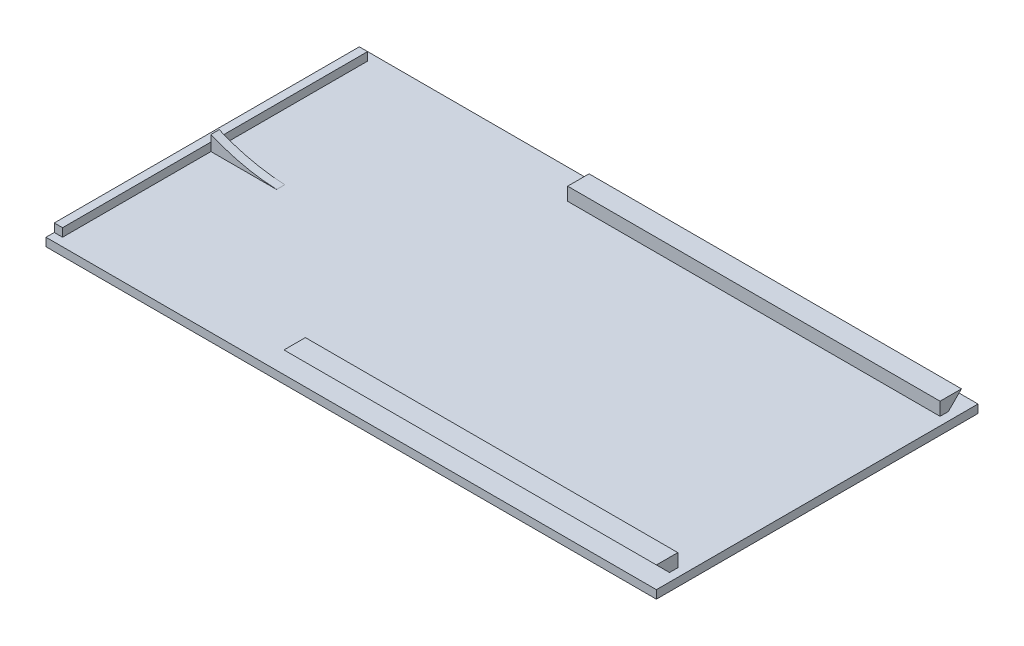
ISO-10303-21;
HEADER;
FILE_DESCRIPTION(('STEP AP214'),'2;1');
FILE_NAME('part.step','',(''),(''),'','','');
FILE_SCHEMA(('AUTOMOTIVE_DESIGN { 1 0 10303 214 1 1 1 1 }'));
ENDSEC;
DATA;
#1=APPLICATION_CONTEXT('core data for automotive mechanical design processes');
#2=APPLICATION_PROTOCOL_DEFINITION('international standard','automotive_design',2000,#1);
#3=PRODUCT_CONTEXT('',#1,'mechanical');
#4=PRODUCT('Part','Part','',(#3));
#5=PRODUCT_RELATED_PRODUCT_CATEGORY('part','',(#4));
#6=PRODUCT_DEFINITION_FORMATION('','',#4);
#7=PRODUCT_DEFINITION_CONTEXT('part definition',#1,'design');
#8=PRODUCT_DEFINITION('design','',#6,#7);
#9=PRODUCT_DEFINITION_SHAPE('','',#8);
#10=(LENGTH_UNIT() NAMED_UNIT(*) SI_UNIT(.MILLI.,.METRE.));
#11=(NAMED_UNIT(*) PLANE_ANGLE_UNIT() SI_UNIT($,.RADIAN.));
#12=(NAMED_UNIT(*) SI_UNIT($,.STERADIAN.) SOLID_ANGLE_UNIT());
#13=UNCERTAINTY_MEASURE_WITH_UNIT(LENGTH_MEASURE(1.E-05),#10,'distance_accuracy_value','');
#14=(GEOMETRIC_REPRESENTATION_CONTEXT(3) GLOBAL_UNCERTAINTY_ASSIGNED_CONTEXT((#13)) GLOBAL_UNIT_ASSIGNED_CONTEXT((#10,
#11,#12)) REPRESENTATION_CONTEXT('',''));
#15=CARTESIAN_POINT('',(0.,0.,0.));
#16=DIRECTION('',(0.,0.,1.));
#17=DIRECTION('',(1.,0.,0.));
#18=AXIS2_PLACEMENT_3D('',#15,#16,#17);
#19=CARTESIAN_POINT('',(0.,1.26,0.));
#20=DIRECTION('',(0.,-1.,0.));
#21=DIRECTION('',(0.,0.,-1.));
#22=AXIS2_PLACEMENT_3D('',#19,#20,#21);
#23=PLANE('',#22);
#24=DIRECTION('',(0.,0.,1.));
#25=VECTOR('',#24,1.);
#26=CARTESIAN_POINT('',(35.,1.26,-44.48));
#27=LINE('',#26,#25);
#28=CARTESIAN_POINT('',(35.,1.26,-45.7377762362813));
#29=VERTEX_POINT('',#28);
#30=CARTESIAN_POINT('',(35.,1.26,-44.48));
#31=VERTEX_POINT('',#30);
#32=EDGE_CURVE('E58',#29,#31,#27,.T.);
#33=ORIENTED_EDGE('',*,*,#32,.F.);
#34=DIRECTION('',(1.,0.,0.));
#35=VECTOR('',#34,1.);
#36=CARTESIAN_POINT('',(29.74,1.26,-45.7377762362813));
#37=LINE('',#36,#35);
#38=CARTESIAN_POINT('',(91.74,1.26,-45.7377762362813));
#39=VERTEX_POINT('',#38);
#40=EDGE_CURVE('E194',#29,#39,#37,.T.);
#41=ORIENTED_EDGE('',*,*,#40,.T.);
#42=DIRECTION('',(0.,0.,-1.));
#43=VECTOR('',#42,1.);
#44=CARTESIAN_POINT('',(91.74,1.26,-44.48));
#45=LINE('',#44,#43);
#46=CARTESIAN_POINT('',(91.74,1.26,-44.48));
#47=VERTEX_POINT('',#46);
#48=EDGE_CURVE('E193',#47,#39,#45,.T.);
#49=ORIENTED_EDGE('',*,*,#48,.F.);
#50=DIRECTION('',(1.,0.,0.));
#51=VECTOR('',#50,1.);
#52=CARTESIAN_POINT('',(35.,1.26,-44.48));
#53=LINE('',#52,#51);
#54=EDGE_CURVE('E205',#31,#47,#53,.T.);
#55=ORIENTED_EDGE('',*,*,#54,.F.);
#56=EDGE_LOOP('',(#33,#41,#49,#55));
#57=FACE_BOUND('',#56,.T.);
#58=DIRECTION('',(1.,0.,0.));
#59=VECTOR('',#58,1.);
#60=CARTESIAN_POINT('',(29.74,1.26,-3.26222376371873));
#61=LINE('',#60,#59);
#62=CARTESIAN_POINT('',(35.,1.26,-3.26222376371873));
#63=VERTEX_POINT('',#62);
#64=CARTESIAN_POINT('',(91.74,1.26,-3.26222376371873));
#65=VERTEX_POINT('',#64);
#66=EDGE_CURVE('E579',#63,#65,#61,.T.);
#67=ORIENTED_EDGE('',*,*,#66,.F.);
#68=DIRECTION('',(0.,0.,1.));
#69=VECTOR('',#68,1.);
#70=CARTESIAN_POINT('',(35.,1.26,-1.26));
#71=LINE('',#70,#69);
#72=CARTESIAN_POINT('',(35.,1.26,-4.52));
#73=VERTEX_POINT('',#72);
#74=EDGE_CURVE('E592',#73,#63,#71,.T.);
#75=ORIENTED_EDGE('',*,*,#74,.F.);
#76=DIRECTION('',(-1.,0.,0.));
#77=VECTOR('',#76,1.);
#78=CARTESIAN_POINT('',(35.,1.26,-4.52));
#79=LINE('',#78,#77);
#80=CARTESIAN_POINT('',(91.74,1.26,-4.52));
#81=VERTEX_POINT('',#80);
#82=EDGE_CURVE('E590',#81,#73,#79,.T.);
#83=ORIENTED_EDGE('',*,*,#82,.F.);
#84=DIRECTION('',(0.,0.,-1.));
#85=VECTOR('',#84,1.);
#86=CARTESIAN_POINT('',(91.74,1.26,-1.26));
#87=LINE('',#86,#85);
#88=EDGE_CURVE('E50',#65,#81,#87,.T.);
#89=ORIENTED_EDGE('',*,*,#88,.F.);
#90=EDGE_LOOP('',(#67,#75,#83,#89));
#91=FACE_BOUND('',#90,.T.);
#92=DIRECTION('',(1.,0.,0.));
#93=VECTOR('',#92,1.);
#94=CARTESIAN_POINT('',(1.25999999999999,1.26,-23.87));
#95=LINE('',#94,#93);
#96=CARTESIAN_POINT('',(1.25999999999999,1.26,-23.87));
#97=VERTEX_POINT('',#96);
#98=CARTESIAN_POINT('',(11.26,1.26,-23.87));
#99=VERTEX_POINT('',#98);
#100=EDGE_CURVE('E218',#97,#99,#95,.T.);
#101=ORIENTED_EDGE('',*,*,#100,.F.);
#102=DIRECTION('',(0.,0.,-1.));
#103=VECTOR('',#102,1.);
#104=CARTESIAN_POINT('',(1.25999999999997,1.26,-47.74));
#105=LINE('',#104,#103);
#106=CARTESIAN_POINT('',(1.25999999999998,1.26,-1.26));
#107=VERTEX_POINT('',#106);
#108=EDGE_CURVE('E250',#107,#97,#105,.T.);
#109=ORIENTED_EDGE('',*,*,#108,.F.);
#110=DIRECTION('',(1.,0.,0.));
#111=VECTOR('',#110,1.);
#112=CARTESIAN_POINT('',(0.,1.26,-1.26));
#113=LINE('',#112,#111);
#114=CARTESIAN_POINT('',(0.,1.26,-1.26));
#115=VERTEX_POINT('',#114);
#116=EDGE_CURVE('E235',#115,#107,#113,.T.);
#117=ORIENTED_EDGE('',*,*,#116,.F.);
#118=DIRECTION('',(0.,0.,1.));
#119=VECTOR('',#118,1.);
#120=CARTESIAN_POINT('',(0.,1.26,0.));
#121=LINE('',#120,#119);
#122=CARTESIAN_POINT('',(0.,1.26,0.));
#123=VERTEX_POINT('',#122);
#124=EDGE_CURVE('E287',#115,#123,#121,.T.);
#125=ORIENTED_EDGE('',*,*,#124,.T.);
#126=DIRECTION('',(1.,0.,0.));
#127=VECTOR('',#126,1.);
#128=CARTESIAN_POINT('',(0.,1.26,0.));
#129=LINE('',#128,#127);
#130=CARTESIAN_POINT('',(93.,1.26,0.));
#131=VERTEX_POINT('',#130);
#132=EDGE_CURVE('E283',#123,#131,#129,.T.);
#133=ORIENTED_EDGE('',*,*,#132,.T.);
#134=DIRECTION('',(0.,0.,-1.));
#135=VECTOR('',#134,1.);
#136=CARTESIAN_POINT('',(93.,1.26,0.));
#137=LINE('',#136,#135);
#138=CARTESIAN_POINT('',(93.,1.26,-49.));
#139=VERTEX_POINT('',#138);
#140=EDGE_CURVE('E309',#131,#139,#137,.T.);
#141=ORIENTED_EDGE('',*,*,#140,.T.);
#142=DIRECTION('',(-1.,0.,0.));
#143=VECTOR('',#142,1.);
#144=CARTESIAN_POINT('',(0.,1.26,-49.));
#145=LINE('',#144,#143);
#146=CARTESIAN_POINT('',(0.,1.26,-49.));
#147=VERTEX_POINT('',#146);
#148=EDGE_CURVE('E300',#139,#147,#145,.T.);
#149=ORIENTED_EDGE('',*,*,#148,.T.);
#150=CARTESIAN_POINT('',(0.,1.26,-47.74));
#151=VERTEX_POINT('',#150);
#152=EDGE_CURVE('E290',#147,#151,#121,.T.);
#153=ORIENTED_EDGE('',*,*,#152,.T.);
#154=DIRECTION('',(-1.,0.,0.));
#155=VECTOR('',#154,1.);
#156=CARTESIAN_POINT('',(0.,1.26,-47.74));
#157=LINE('',#156,#155);
#158=CARTESIAN_POINT('',(1.25999999999997,1.26,-47.74));
#159=VERTEX_POINT('',#158);
#160=EDGE_CURVE('E240',#159,#151,#157,.T.);
#161=ORIENTED_EDGE('',*,*,#160,.F.);
#162=CARTESIAN_POINT('',(1.25999999999998,1.26,-25.13));
#163=VERTEX_POINT('',#162);
#164=EDGE_CURVE('E253',#163,#159,#105,.T.);
#165=ORIENTED_EDGE('',*,*,#164,.F.);
#166=DIRECTION('',(-1.,0.,0.));
#167=VECTOR('',#166,1.);
#168=CARTESIAN_POINT('',(1.25999999999998,1.26,-25.13));
#169=LINE('',#168,#167);
#170=CARTESIAN_POINT('',(11.26,1.26,-25.13));
#171=VERTEX_POINT('',#170);
#172=EDGE_CURVE('E223',#171,#163,#169,.T.);
#173=ORIENTED_EDGE('',*,*,#172,.F.);
#174=DIRECTION('',(0.,0.,-1.));
#175=VECTOR('',#174,1.);
#176=CARTESIAN_POINT('',(11.26,1.26,-25.13));
#177=LINE('',#176,#175);
#178=EDGE_CURVE('E226',#99,#171,#177,.T.);
#179=ORIENTED_EDGE('',*,*,#178,.F.);
#180=EDGE_LOOP('',(#101,#109,#117,#125,#133,#141,#149,#153,#161,#165,#173,#179));
#181=FACE_BOUND('',#180,.T.);
#182=ADVANCED_FACE('F33',(#57,#91,#181),#23,.F.);
#183=CARTESIAN_POINT('',(1.25999999999997,2.52,-47.74));
#184=DIRECTION('',(-1.,0.,0.));
#185=DIRECTION('',(0.,0.,1.));
#186=AXIS2_PLACEMENT_3D('',#183,#184,#185);
#187=PLANE('',#186);
#188=DIRECTION('',(0.,-1.,0.));
#189=VECTOR('',#188,1.);
#190=CARTESIAN_POINT('',(1.25999999999999,3.52,-23.87));
#191=LINE('',#190,#189);
#192=CARTESIAN_POINT('',(1.25999999999999,2.52,-23.87));
#193=VERTEX_POINT('',#192);
#194=EDGE_CURVE('E231',#193,#97,#191,.T.);
#195=ORIENTED_EDGE('',*,*,#194,.F.);
#196=DIRECTION('',(0.,0.,-1.));
#197=VECTOR('',#196,1.);
#198=CARTESIAN_POINT('',(1.25999999999997,2.52,-47.74));
#199=LINE('',#198,#197);
#200=CARTESIAN_POINT('',(1.25999999999998,2.52,-1.26));
#201=VERTEX_POINT('',#200);
#202=EDGE_CURVE('E243',#201,#193,#199,.T.);
#203=ORIENTED_EDGE('',*,*,#202,.F.);
#204=DIRECTION('',(0.,-1.,0.));
#205=VECTOR('',#204,1.);
#206=CARTESIAN_POINT('',(1.25999999999998,2.52,-1.26));
#207=LINE('',#206,#205);
#208=EDGE_CURVE('E269',#201,#107,#207,.T.);
#209=ORIENTED_EDGE('',*,*,#208,.T.);
#210=ORIENTED_EDGE('',*,*,#108,.T.);
#211=EDGE_LOOP('',(#195,#203,#209,#210));
#212=FACE_BOUND('',#211,.T.);
#213=ADVANCED_FACE('F359',(#212),#187,.F.);
#214=DIRECTION('',(0.,-1.,0.));
#215=VECTOR('',#214,1.);
#216=CARTESIAN_POINT('',(1.25999999999998,3.52,-25.13));
#217=LINE('',#216,#215);
#218=CARTESIAN_POINT('',(1.25999999999997,2.52,-25.13));
#219=VERTEX_POINT('',#218);
#220=EDGE_CURVE('E222',#219,#163,#217,.T.);
#221=ORIENTED_EDGE('',*,*,#220,.T.);
#222=ORIENTED_EDGE('',*,*,#164,.T.);
#223=DIRECTION('',(0.,-1.,0.));
#224=VECTOR('',#223,1.);
#225=CARTESIAN_POINT('',(1.25999999999997,2.52,-47.74));
#226=LINE('',#225,#224);
#227=CARTESIAN_POINT('',(1.25999999999997,2.52,-47.74));
#228=VERTEX_POINT('',#227);
#229=EDGE_CURVE('E256',#228,#159,#226,.T.);
#230=ORIENTED_EDGE('',*,*,#229,.F.);
#231=EDGE_CURVE('E242',#219,#228,#199,.T.);
#232=ORIENTED_EDGE('',*,*,#231,.F.);
#233=EDGE_LOOP('',(#221,#222,#230,#232));
#234=FACE_BOUND('',#233,.T.);
#235=ADVANCED_FACE('F338',(#234),#187,.F.);
#236=CARTESIAN_POINT('',(0.,1.26,0.));
#237=DIRECTION('',(1.,0.,0.));
#238=DIRECTION('',(0.,0.,-1.));
#239=AXIS2_PLACEMENT_3D('',#236,#237,#238);
#240=PLANE('',#239);
#241=DIRECTION('',(0.,0.,1.));
#242=VECTOR('',#241,1.);
#243=CARTESIAN_POINT('',(0.,0.,0.));
#244=LINE('',#243,#242);
#245=CARTESIAN_POINT('',(0.,0.,-49.));
#246=VERTEX_POINT('',#245);
#247=CARTESIAN_POINT('',(0.,0.,0.));
#248=VERTEX_POINT('',#247);
#249=EDGE_CURVE('E279',#246,#248,#244,.T.);
#250=ORIENTED_EDGE('',*,*,#249,.T.);
#251=DIRECTION('',(0.,-1.,0.));
#252=VECTOR('',#251,1.);
#253=CARTESIAN_POINT('',(0.,1.26,0.));
#254=LINE('',#253,#252);
#255=EDGE_CURVE('E11',#123,#248,#254,.T.);
#256=ORIENTED_EDGE('',*,*,#255,.F.);
#257=ORIENTED_EDGE('',*,*,#124,.F.);
#258=DIRECTION('',(0.,-1.,0.));
#259=VECTOR('',#258,1.);
#260=CARTESIAN_POINT('',(0.,2.52,-1.26));
#261=LINE('',#260,#259);
#262=CARTESIAN_POINT('',(0.,2.52,-1.26));
#263=VERTEX_POINT('',#262);
#264=EDGE_CURVE('E274',#263,#115,#261,.T.);
#265=ORIENTED_EDGE('',*,*,#264,.F.);
#266=DIRECTION('',(0.,0.,1.));
#267=VECTOR('',#266,1.);
#268=CARTESIAN_POINT('',(0.,2.52,-47.74));
#269=LINE('',#268,#267);
#270=CARTESIAN_POINT('',(0.,2.52,-47.74));
#271=VERTEX_POINT('',#270);
#272=EDGE_CURVE('E236',#271,#263,#269,.T.);
#273=ORIENTED_EDGE('',*,*,#272,.F.);
#274=DIRECTION('',(0.,-1.,0.));
#275=VECTOR('',#274,1.);
#276=CARTESIAN_POINT('',(0.,2.52,-47.74));
#277=LINE('',#276,#275);
#278=EDGE_CURVE('E249',#271,#151,#277,.T.);
#279=ORIENTED_EDGE('',*,*,#278,.T.);
#280=ORIENTED_EDGE('',*,*,#152,.F.);
#281=DIRECTION('',(0.,-1.,0.));
#282=VECTOR('',#281,1.);
#283=CARTESIAN_POINT('',(0.,1.26,-49.));
#284=LINE('',#283,#282);
#285=EDGE_CURVE('E297',#147,#246,#284,.T.);
#286=ORIENTED_EDGE('',*,*,#285,.T.);
#287=EDGE_LOOP('',(#250,#256,#257,#265,#273,#279,#280,#286));
#288=FACE_BOUND('',#287,.T.);
#289=ADVANCED_FACE('F35',(#288),#240,.F.);
#290=CARTESIAN_POINT('',(0.,1.26,0.));
#291=DIRECTION('',(0.,0.,-1.));
#292=DIRECTION('',(-1.,0.,0.));
#293=AXIS2_PLACEMENT_3D('',#290,#291,#292);
#294=PLANE('',#293);
#295=DIRECTION('',(1.,0.,0.));
#296=VECTOR('',#295,1.);
#297=CARTESIAN_POINT('',(0.,0.,0.));
#298=LINE('',#297,#296);
#299=CARTESIAN_POINT('',(93.,0.,0.));
#300=VERTEX_POINT('',#299);
#301=EDGE_CURVE('E305',#248,#300,#298,.T.);
#302=ORIENTED_EDGE('',*,*,#301,.T.);
#303=DIRECTION('',(0.,-1.,0.));
#304=VECTOR('',#303,1.);
#305=CARTESIAN_POINT('',(93.,1.26,0.));
#306=LINE('',#305,#304);
#307=EDGE_CURVE('E42',#131,#300,#306,.T.);
#308=ORIENTED_EDGE('',*,*,#307,.F.);
#309=ORIENTED_EDGE('',*,*,#132,.F.);
#310=ORIENTED_EDGE('',*,*,#255,.T.);
#311=EDGE_LOOP('',(#302,#308,#309,#310));
#312=FACE_BOUND('',#311,.T.);
#313=ADVANCED_FACE('F319',(#312),#294,.F.);
#314=CARTESIAN_POINT('',(93.,1.26,0.));
#315=DIRECTION('',(-1.,0.,0.));
#316=DIRECTION('',(0.,0.,1.));
#317=AXIS2_PLACEMENT_3D('',#314,#315,#316);
#318=PLANE('',#317);
#319=DIRECTION('',(0.,0.,-1.));
#320=VECTOR('',#319,1.);
#321=CARTESIAN_POINT('',(93.,0.,0.));
#322=LINE('',#321,#320);
#323=CARTESIAN_POINT('',(93.,0.,-49.));
#324=VERTEX_POINT('',#323);
#325=EDGE_CURVE('E303',#300,#324,#322,.T.);
#326=ORIENTED_EDGE('',*,*,#325,.T.);
#327=DIRECTION('',(0.,-1.,0.));
#328=VECTOR('',#327,1.);
#329=CARTESIAN_POINT('',(93.,1.26,-49.));
#330=LINE('',#329,#328);
#331=EDGE_CURVE('E294',#139,#324,#330,.T.);
#332=ORIENTED_EDGE('',*,*,#331,.F.);
#333=ORIENTED_EDGE('',*,*,#140,.F.);
#334=ORIENTED_EDGE('',*,*,#307,.T.);
#335=EDGE_LOOP('',(#326,#332,#333,#334));
#336=FACE_BOUND('',#335,.T.);
#337=ADVANCED_FACE('F322',(#336),#318,.F.);
#338=CARTESIAN_POINT('',(0.,1.26,-49.));
#339=DIRECTION('',(0.,0.,1.));
#340=DIRECTION('',(1.,0.,0.));
#341=AXIS2_PLACEMENT_3D('',#338,#339,#340);
#342=PLANE('',#341);
#343=DIRECTION('',(-1.,0.,0.));
#344=VECTOR('',#343,1.);
#345=CARTESIAN_POINT('',(0.,0.,-49.));
#346=LINE('',#345,#344);
#347=EDGE_CURVE('E301',#324,#246,#346,.T.);
#348=ORIENTED_EDGE('',*,*,#347,.T.);
#349=ORIENTED_EDGE('',*,*,#285,.F.);
#350=ORIENTED_EDGE('',*,*,#148,.F.);
#351=ORIENTED_EDGE('',*,*,#331,.T.);
#352=EDGE_LOOP('',(#348,#349,#350,#351));
#353=FACE_BOUND('',#352,.T.);
#354=ADVANCED_FACE('F327',(#353),#342,.F.);
#355=CARTESIAN_POINT('',(0.,0.,0.));
#356=DIRECTION('',(0.,-1.,0.));
#357=DIRECTION('',(0.,0.,-1.));
#358=AXIS2_PLACEMENT_3D('',#355,#356,#357);
#359=PLANE('',#358);
#360=ORIENTED_EDGE('',*,*,#249,.F.);
#361=ORIENTED_EDGE('',*,*,#347,.F.);
#362=ORIENTED_EDGE('',*,*,#325,.F.);
#363=ORIENTED_EDGE('',*,*,#301,.F.);
#364=EDGE_LOOP('',(#360,#361,#362,#363));
#365=FACE_BOUND('',#364,.T.);
#366=ADVANCED_FACE('F348',(#365),#359,.T.);
#367=CARTESIAN_POINT('',(0.,2.52,-1.26));
#368=DIRECTION('',(0.,0.,-1.));
#369=DIRECTION('',(-1.,0.,0.));
#370=AXIS2_PLACEMENT_3D('',#367,#368,#369);
#371=PLANE('',#370);
#372=ORIENTED_EDGE('',*,*,#116,.T.);
#373=ORIENTED_EDGE('',*,*,#208,.F.);
#374=DIRECTION('',(1.,0.,0.));
#375=VECTOR('',#374,1.);
#376=CARTESIAN_POINT('',(0.,2.52,-1.26));
#377=LINE('',#376,#375);
#378=EDGE_CURVE('E239',#263,#201,#377,.T.);
#379=ORIENTED_EDGE('',*,*,#378,.F.);
#380=ORIENTED_EDGE('',*,*,#264,.T.);
#381=EDGE_LOOP('',(#372,#373,#379,#380));
#382=FACE_BOUND('',#381,.T.);
#383=ADVANCED_FACE('F345',(#382),#371,.F.);
#384=CARTESIAN_POINT('',(0.,2.52,-47.74));
#385=DIRECTION('',(0.,0.,1.));
#386=DIRECTION('',(1.,0.,0.));
#387=AXIS2_PLACEMENT_3D('',#384,#385,#386);
#388=PLANE('',#387);
#389=ORIENTED_EDGE('',*,*,#160,.T.);
#390=ORIENTED_EDGE('',*,*,#278,.F.);
#391=DIRECTION('',(-1.,0.,0.));
#392=VECTOR('',#391,1.);
#393=CARTESIAN_POINT('',(0.,2.52,-47.74));
#394=LINE('',#393,#392);
#395=EDGE_CURVE('E246',#228,#271,#394,.T.);
#396=ORIENTED_EDGE('',*,*,#395,.F.);
#397=ORIENTED_EDGE('',*,*,#229,.T.);
#398=EDGE_LOOP('',(#389,#390,#396,#397));
#399=FACE_BOUND('',#398,.T.);
#400=ADVANCED_FACE('F330',(#399),#388,.F.);
#401=CARTESIAN_POINT('',(0.,2.52,0.));
#402=DIRECTION('',(0.,1.,0.));
#403=DIRECTION('',(0.,0.,1.));
#404=AXIS2_PLACEMENT_3D('',#401,#402,#403);
#405=PLANE('',#404);
#406=ORIENTED_EDGE('',*,*,#272,.T.);
#407=ORIENTED_EDGE('',*,*,#378,.T.);
#408=ORIENTED_EDGE('',*,*,#202,.T.);
#409=EDGE_CURVE('E247',#193,#219,#199,.T.);
#410=ORIENTED_EDGE('',*,*,#409,.T.);
#411=ORIENTED_EDGE('',*,*,#231,.T.);
#412=ORIENTED_EDGE('',*,*,#395,.T.);
#413=EDGE_LOOP('',(#406,#407,#408,#410,#411,#412));
#414=FACE_BOUND('',#413,.T.);
#415=ADVANCED_FACE('F333',(#414),#405,.T.);
#416=CARTESIAN_POINT('',(1.25999999999998,3.52,-25.13));
#417=DIRECTION('',(1.,0.,0.));
#418=DIRECTION('',(0.,0.,-1.));
#419=AXIS2_PLACEMENT_3D('',#416,#417,#418);
#420=PLANE('',#419);
#421=ORIENTED_EDGE('',*,*,#409,.F.);
#422=CARTESIAN_POINT('',(1.25999999999999,3.52,-23.87));
#423=VERTEX_POINT('',#422);
#424=EDGE_CURVE('E232',#423,#193,#191,.T.);
#425=ORIENTED_EDGE('',*,*,#424,.F.);
#426=DIRECTION('',(0.,0.,1.));
#427=VECTOR('',#426,1.);
#428=CARTESIAN_POINT('',(1.25999999999998,3.52,-25.13));
#429=LINE('',#428,#427);
#430=CARTESIAN_POINT('',(1.25999999999998,3.52,-25.13));
#431=VERTEX_POINT('',#430);
#432=EDGE_CURVE('E220',#431,#423,#429,.T.);
#433=ORIENTED_EDGE('',*,*,#432,.F.);
#434=EDGE_CURVE('E229',#431,#219,#217,.T.);
#435=ORIENTED_EDGE('',*,*,#434,.T.);
#436=EDGE_LOOP('',(#421,#425,#433,#435));
#437=FACE_BOUND('',#436,.T.);
#438=ADVANCED_FACE('F373',(#437),#420,.F.);
#439=CARTESIAN_POINT('',(1.25999999999999,3.52,-23.87));
#440=DIRECTION('',(0.,0.,-1.));
#441=DIRECTION('',(-1.,0.,0.));
#442=AXIS2_PLACEMENT_3D('',#439,#440,#441);
#443=PLANE('',#442);
#444=ORIENTED_EDGE('',*,*,#100,.T.);
#445=CARTESIAN_POINT('',(12.4759318746487,29.8941233391537,-23.87));
#446=DIRECTION('',(0.,0.,1.));
#447=DIRECTION('',(1.,0.,0.));
#448=AXIS2_PLACEMENT_3D('',#445,#446,#447);
#449=CIRCLE('',#448,28.6599286413217);
#450=EDGE_CURVE('E214',#423,#99,#449,.T.);
#451=ORIENTED_EDGE('',*,*,#450,.F.);
#452=ORIENTED_EDGE('',*,*,#424,.T.);
#453=ORIENTED_EDGE('',*,*,#194,.T.);
#454=EDGE_LOOP('',(#444,#451,#452,#453));
#455=FACE_BOUND('',#454,.T.);
#456=ADVANCED_FACE('F376',(#455),#443,.F.);
#457=CARTESIAN_POINT('',(1.25999999999998,3.52,-25.13));
#458=DIRECTION('',(0.,0.,1.));
#459=DIRECTION('',(1.,0.,0.));
#460=AXIS2_PLACEMENT_3D('',#457,#458,#459);
#461=PLANE('',#460);
#462=ORIENTED_EDGE('',*,*,#434,.F.);
#463=CARTESIAN_POINT('',(12.4759318746487,29.8941233391537,-25.13));
#464=DIRECTION('',(0.,0.,1.));
#465=DIRECTION('',(1.,0.,0.));
#466=AXIS2_PLACEMENT_3D('',#463,#464,#465);
#467=CIRCLE('',#466,28.6599286413217);
#468=EDGE_CURVE('E215',#431,#171,#467,.T.);
#469=ORIENTED_EDGE('',*,*,#468,.T.);
#470=ORIENTED_EDGE('',*,*,#172,.T.);
#471=ORIENTED_EDGE('',*,*,#220,.F.);
#472=EDGE_LOOP('',(#462,#469,#470,#471));
#473=FACE_BOUND('',#472,.T.);
#474=ADVANCED_FACE('F380',(#473),#461,.F.);
#475=CARTESIAN_POINT('',(12.4759318746487,29.8941233391537,-25.13));
#476=DIRECTION('',(0.,0.,1.));
#477=DIRECTION('',(1.,0.,0.));
#478=AXIS2_PLACEMENT_3D('',#475,#476,#477);
#479=CYLINDRICAL_SURFACE('',#478,28.6599286413217);
#480=ORIENTED_EDGE('',*,*,#450,.T.);
#481=ORIENTED_EDGE('',*,*,#178,.T.);
#482=ORIENTED_EDGE('',*,*,#468,.F.);
#483=ORIENTED_EDGE('',*,*,#432,.T.);
#484=EDGE_LOOP('',(#480,#481,#482,#483));
#485=FACE_BOUND('',#484,.T.);
#486=ADVANCED_FACE('F384',(#485),#479,.F.);
#487=CARTESIAN_POINT('',(35.,3.26,-44.48));
#488=DIRECTION('',(1.,0.,0.));
#489=DIRECTION('',(0.,0.,-1.));
#490=AXIS2_PLACEMENT_3D('',#487,#488,#489);
#491=PLANE('',#490);
#492=DIRECTION('',(0.,0.,1.));
#493=VECTOR('',#492,1.);
#494=CARTESIAN_POINT('',(35.,3.26,-44.48));
#495=LINE('',#494,#493);
#496=CARTESIAN_POINT('',(35.,3.26,-47.74));
#497=VERTEX_POINT('',#496);
#498=CARTESIAN_POINT('',(35.,3.26,-44.48));
#499=VERTEX_POINT('',#498);
#500=EDGE_CURVE('E200',#497,#499,#495,.T.);
#501=ORIENTED_EDGE('',*,*,#500,.F.);
#502=DIRECTION('',(0.,-0.706713780918728,0.707499563151495));
#503=VECTOR('',#502,1.);
#504=CARTESIAN_POINT('',(35.,1.63000100644956,-46.1081886401379));
#505=LINE('',#504,#503);
#506=EDGE_CURVE('E181',#497,#29,#505,.T.);
#507=ORIENTED_EDGE('',*,*,#506,.T.);
#508=ORIENTED_EDGE('',*,*,#32,.T.);
#509=DIRECTION('',(0.,-1.,0.));
#510=VECTOR('',#509,1.);
#511=CARTESIAN_POINT('',(35.,3.26,-44.48));
#512=LINE('',#511,#510);
#513=EDGE_CURVE('E211',#499,#31,#512,.T.);
#514=ORIENTED_EDGE('',*,*,#513,.F.);
#515=EDGE_LOOP('',(#501,#507,#508,#514));
#516=FACE_BOUND('',#515,.T.);
#517=ADVANCED_FACE('F387',(#516),#491,.F.);
#518=CARTESIAN_POINT('',(35.,3.26,-44.48));
#519=DIRECTION('',(0.,0.,-1.));
#520=DIRECTION('',(-1.,0.,0.));
#521=AXIS2_PLACEMENT_3D('',#518,#519,#520);
#522=PLANE('',#521);
#523=ORIENTED_EDGE('',*,*,#54,.T.);
#524=DIRECTION('',(0.,-1.,0.));
#525=VECTOR('',#524,1.);
#526=CARTESIAN_POINT('',(91.74,3.26,-44.48));
#527=LINE('',#526,#525);
#528=CARTESIAN_POINT('',(91.74,3.26,-44.48));
#529=VERTEX_POINT('',#528);
#530=EDGE_CURVE('E186',#529,#47,#527,.T.);
#531=ORIENTED_EDGE('',*,*,#530,.F.);
#532=DIRECTION('',(1.,0.,0.));
#533=VECTOR('',#532,1.);
#534=CARTESIAN_POINT('',(35.,3.26,-44.48));
#535=LINE('',#534,#533);
#536=EDGE_CURVE('E197',#499,#529,#535,.T.);
#537=ORIENTED_EDGE('',*,*,#536,.F.);
#538=ORIENTED_EDGE('',*,*,#513,.T.);
#539=EDGE_LOOP('',(#523,#531,#537,#538));
#540=FACE_BOUND('',#539,.T.);
#541=ADVANCED_FACE('F390',(#540),#522,.F.);
#542=CARTESIAN_POINT('',(91.74,3.26,-44.48));
#543=DIRECTION('',(-1.,0.,0.));
#544=DIRECTION('',(0.,0.,1.));
#545=AXIS2_PLACEMENT_3D('',#542,#543,#544);
#546=PLANE('',#545);
#547=ORIENTED_EDGE('',*,*,#48,.T.);
#548=DIRECTION('',(0.,-0.706713780918728,0.707499563151495));
#549=VECTOR('',#548,1.);
#550=CARTESIAN_POINT('',(91.74,1.26,-45.7377762362813));
#551=LINE('',#550,#549);
#552=CARTESIAN_POINT('',(91.74,3.26,-47.74));
#553=VERTEX_POINT('',#552);
#554=EDGE_CURVE('E179',#553,#39,#551,.T.);
#555=ORIENTED_EDGE('',*,*,#554,.F.);
#556=DIRECTION('',(0.,0.,-1.));
#557=VECTOR('',#556,1.);
#558=CARTESIAN_POINT('',(91.74,3.26,-44.48));
#559=LINE('',#558,#557);
#560=EDGE_CURVE('E187',#529,#553,#559,.T.);
#561=ORIENTED_EDGE('',*,*,#560,.F.);
#562=ORIENTED_EDGE('',*,*,#530,.T.);
#563=EDGE_LOOP('',(#547,#555,#561,#562));
#564=FACE_BOUND('',#563,.T.);
#565=ADVANCED_FACE('F191',(#564),#546,.F.);
#566=CARTESIAN_POINT('',(0.,3.26,0.));
#567=DIRECTION('',(0.,-1.,0.));
#568=DIRECTION('',(0.,0.,-1.));
#569=AXIS2_PLACEMENT_3D('',#566,#567,#568);
#570=PLANE('',#569);
#571=ORIENTED_EDGE('',*,*,#500,.T.);
#572=ORIENTED_EDGE('',*,*,#536,.T.);
#573=ORIENTED_EDGE('',*,*,#560,.T.);
#574=DIRECTION('',(-1.,0.,0.));
#575=VECTOR('',#574,1.);
#576=CARTESIAN_POINT('',(35.,3.26,-47.74));
#577=LINE('',#576,#575);
#578=EDGE_CURVE('E176',#553,#497,#577,.T.);
#579=ORIENTED_EDGE('',*,*,#578,.T.);
#580=EDGE_LOOP('',(#571,#572,#573,#579));
#581=FACE_BOUND('',#580,.T.);
#582=ADVANCED_FACE('F196',(#581),#570,.F.);
#583=CARTESIAN_POINT('',(35.,3.26,-1.26));
#584=DIRECTION('',(1.,0.,0.));
#585=DIRECTION('',(0.,0.,-1.));
#586=AXIS2_PLACEMENT_3D('',#583,#584,#585);
#587=PLANE('',#586);
#588=ORIENTED_EDGE('',*,*,#74,.T.);
#589=DIRECTION('',(0.,0.706713780918728,0.707499563151495));
#590=VECTOR('',#589,1.);
#591=CARTESIAN_POINT('',(35.,3.26,-1.26));
#592=LINE('',#591,#590);
#593=CARTESIAN_POINT('',(35.,3.26,-1.26));
#594=VERTEX_POINT('',#593);
#595=EDGE_CURVE('E583',#63,#594,#592,.T.);
#596=ORIENTED_EDGE('',*,*,#595,.T.);
#597=DIRECTION('',(0.,0.,1.));
#598=VECTOR('',#597,1.);
#599=CARTESIAN_POINT('',(35.,3.26,-1.26));
#600=LINE('',#599,#598);
#601=CARTESIAN_POINT('',(35.,3.26,-4.52));
#602=VERTEX_POINT('',#601);
#603=EDGE_CURVE('E594',#602,#594,#600,.T.);
#604=ORIENTED_EDGE('',*,*,#603,.F.);
#605=DIRECTION('',(0.,-1.,0.));
#606=VECTOR('',#605,1.);
#607=CARTESIAN_POINT('',(35.,3.26,-4.52));
#608=LINE('',#607,#606);
#609=EDGE_CURVE('E599',#602,#73,#608,.T.);
#610=ORIENTED_EDGE('',*,*,#609,.T.);
#611=EDGE_LOOP('',(#588,#596,#604,#610));
#612=FACE_BOUND('',#611,.T.);
#613=ADVANCED_FACE('F398',(#612),#587,.F.);
#614=CARTESIAN_POINT('',(91.74,3.26,-1.26));
#615=DIRECTION('',(-1.,0.,0.));
#616=DIRECTION('',(0.,0.,1.));
#617=AXIS2_PLACEMENT_3D('',#614,#615,#616);
#618=PLANE('',#617);
#619=DIRECTION('',(0.,0.,-1.));
#620=VECTOR('',#619,1.);
#621=CARTESIAN_POINT('',(91.74,3.26,-1.26));
#622=LINE('',#621,#620);
#623=CARTESIAN_POINT('',(91.74,3.26,-1.26));
#624=VERTEX_POINT('',#623);
#625=CARTESIAN_POINT('',(91.74,3.26,-4.52));
#626=VERTEX_POINT('',#625);
#627=EDGE_CURVE('E587',#624,#626,#622,.T.);
#628=ORIENTED_EDGE('',*,*,#627,.F.);
#629=DIRECTION('',(0.,0.706713780918728,0.707499563151495));
#630=VECTOR('',#629,1.);
#631=CARTESIAN_POINT('',(91.74,1.26,-3.26222376371873));
#632=LINE('',#631,#630);
#633=EDGE_CURVE('E580',#65,#624,#632,.T.);
#634=ORIENTED_EDGE('',*,*,#633,.F.);
#635=ORIENTED_EDGE('',*,*,#88,.T.);
#636=DIRECTION('',(0.,-1.,0.));
#637=VECTOR('',#636,1.);
#638=CARTESIAN_POINT('',(91.74,3.26,-4.52));
#639=LINE('',#638,#637);
#640=EDGE_CURVE('E206',#626,#81,#639,.T.);
#641=ORIENTED_EDGE('',*,*,#640,.F.);
#642=EDGE_LOOP('',(#628,#634,#635,#641));
#643=FACE_BOUND('',#642,.T.);
#644=ADVANCED_FACE('F401',(#643),#618,.F.);
#645=CARTESIAN_POINT('',(35.,3.26,-4.52));
#646=DIRECTION('',(0.,0.,1.));
#647=DIRECTION('',(1.,0.,0.));
#648=AXIS2_PLACEMENT_3D('',#645,#646,#647);
#649=PLANE('',#648);
#650=ORIENTED_EDGE('',*,*,#82,.T.);
#651=ORIENTED_EDGE('',*,*,#609,.F.);
#652=DIRECTION('',(-1.,0.,0.));
#653=VECTOR('',#652,1.);
#654=CARTESIAN_POINT('',(35.,3.26,-4.52));
#655=LINE('',#654,#653);
#656=EDGE_CURVE('E602',#626,#602,#655,.T.);
#657=ORIENTED_EDGE('',*,*,#656,.F.);
#658=ORIENTED_EDGE('',*,*,#640,.T.);
#659=EDGE_LOOP('',(#650,#651,#657,#658));
#660=FACE_BOUND('',#659,.T.);
#661=ADVANCED_FACE('F405',(#660),#649,.F.);
#662=CARTESIAN_POINT('',(0.,3.26,0.));
#663=DIRECTION('',(0.,-1.,0.));
#664=DIRECTION('',(0.,0.,-1.));
#665=AXIS2_PLACEMENT_3D('',#662,#663,#664);
#666=PLANE('',#665);
#667=ORIENTED_EDGE('',*,*,#603,.T.);
#668=DIRECTION('',(1.,0.,0.));
#669=VECTOR('',#668,1.);
#670=CARTESIAN_POINT('',(35.,3.26,-1.26));
#671=LINE('',#670,#669);
#672=EDGE_CURVE('E609',#594,#624,#671,.T.);
#673=ORIENTED_EDGE('',*,*,#672,.T.);
#674=ORIENTED_EDGE('',*,*,#627,.T.);
#675=ORIENTED_EDGE('',*,*,#656,.T.);
#676=EDGE_LOOP('',(#667,#673,#674,#675));
#677=FACE_BOUND('',#676,.T.);
#678=ADVANCED_FACE('F408',(#677),#666,.F.);
#679=CARTESIAN_POINT('',(29.74,1.26,-3.26222376371873));
#680=DIRECTION('',(0.,0.707499563151495,-0.706713780918728));
#681=DIRECTION('',(0.,0.706713780918728,0.707499563151495));
#682=AXIS2_PLACEMENT_3D('',#679,#680,#681);
#683=PLANE('',#682);
#684=ORIENTED_EDGE('',*,*,#66,.T.);
#685=ORIENTED_EDGE('',*,*,#633,.T.);
#686=ORIENTED_EDGE('',*,*,#672,.F.);
#687=ORIENTED_EDGE('',*,*,#595,.F.);
#688=EDGE_LOOP('',(#684,#685,#686,#687));
#689=FACE_BOUND('',#688,.T.);
#690=ADVANCED_FACE('F412',(#689),#683,.F.);
#691=CARTESIAN_POINT('',(29.74,1.26,-45.7377762362813));
#692=DIRECTION('',(0.,0.707499563151495,0.706713780918728));
#693=DIRECTION('',(0.,-0.706713780918728,0.707499563151495));
#694=AXIS2_PLACEMENT_3D('',#691,#692,#693);
#695=PLANE('',#694);
#696=ORIENTED_EDGE('',*,*,#578,.F.);
#697=ORIENTED_EDGE('',*,*,#554,.T.);
#698=ORIENTED_EDGE('',*,*,#40,.F.);
#699=ORIENTED_EDGE('',*,*,#506,.F.);
#700=EDGE_LOOP('',(#696,#697,#698,#699));
#701=FACE_BOUND('',#700,.T.);
#702=ADVANCED_FACE('F178',(#701),#695,.F.);
#703=CLOSED_SHELL('',(#182,#213,#235,#289,#313,#337,#354,#366,#383,#400,#415,#438,#456,#474,
#486,#517,#541,#565,#582,#613,#644,#661,#678,#690,#702));
#704=MANIFOLD_SOLID_BREP('B2',#703);
#705=ADVANCED_BREP_SHAPE_REPRESENTATION('',(#18,#704),#14);
#706=SHAPE_DEFINITION_REPRESENTATION(#9,#705);
ENDSEC;
END-ISO-10303-21;
